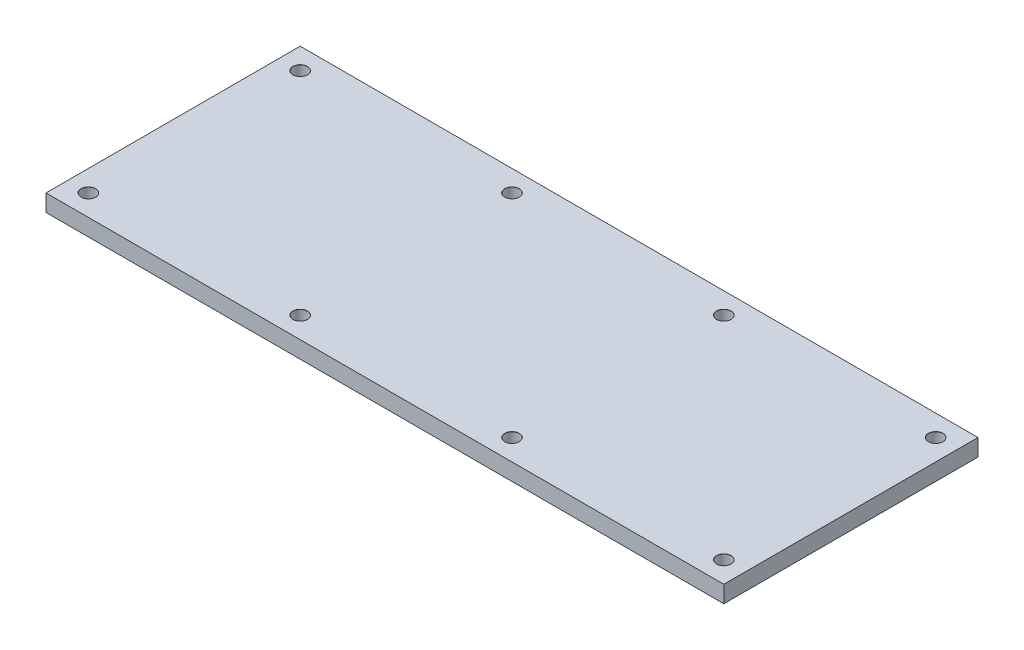
ISO-10303-21;
HEADER;
FILE_DESCRIPTION(('STEP AP214'),'2;1');
FILE_NAME('part.step','',(''),(''),'','','');
FILE_SCHEMA(('AUTOMOTIVE_DESIGN { 1 0 10303 214 1 1 1 1 }'));
ENDSEC;
DATA;
#1=APPLICATION_CONTEXT('core data for automotive mechanical design processes');
#2=APPLICATION_PROTOCOL_DEFINITION('international standard','automotive_design',2000,#1);
#3=PRODUCT_CONTEXT('',#1,'mechanical');
#4=PRODUCT('Part','Part','',(#3));
#5=PRODUCT_RELATED_PRODUCT_CATEGORY('part','',(#4));
#6=PRODUCT_DEFINITION_FORMATION('','',#4);
#7=PRODUCT_DEFINITION_CONTEXT('part definition',#1,'design');
#8=PRODUCT_DEFINITION('design','',#6,#7);
#9=PRODUCT_DEFINITION_SHAPE('','',#8);
#10=(LENGTH_UNIT() NAMED_UNIT(*) SI_UNIT(.MILLI.,.METRE.));
#11=(NAMED_UNIT(*) PLANE_ANGLE_UNIT() SI_UNIT($,.RADIAN.));
#12=(NAMED_UNIT(*) SI_UNIT($,.STERADIAN.) SOLID_ANGLE_UNIT());
#13=UNCERTAINTY_MEASURE_WITH_UNIT(LENGTH_MEASURE(1.E-05),#10,'distance_accuracy_value','');
#14=(GEOMETRIC_REPRESENTATION_CONTEXT(3) GLOBAL_UNCERTAINTY_ASSIGNED_CONTEXT((#13)) GLOBAL_UNIT_ASSIGNED_CONTEXT((#10,
#11,#12)) REPRESENTATION_CONTEXT('',''));
#15=CARTESIAN_POINT('',(0.,0.,0.));
#16=DIRECTION('',(0.,0.,1.));
#17=DIRECTION('',(1.,0.,0.));
#18=AXIS2_PLACEMENT_3D('',#15,#16,#17);
#19=CARTESIAN_POINT('',(0.,4.,0.));
#20=DIRECTION('',(0.,-1.,0.));
#21=DIRECTION('',(0.,0.,-1.));
#22=AXIS2_PLACEMENT_3D('',#19,#20,#21);
#23=PLANE('',#22);
#24=CARTESIAN_POINT('',(4.99999999999984,4.,-55.));
#25=DIRECTION('',(0.,1.,0.));
#26=DIRECTION('',(0.,0.,1.));
#27=AXIS2_PLACEMENT_3D('',#24,#25,#26);
#28=CIRCLE('',#27,1.725);
#29=CARTESIAN_POINT('',(4.99999999999984,4.,-53.275));
#30=VERTEX_POINT('',#29);
#31=EDGE_CURVE('E178',#30,#30,#28,.T.);
#32=ORIENTED_EDGE('',*,*,#31,.F.);
#33=EDGE_LOOP('',(#32));
#34=FACE_BOUND('',#33,.T.);
#35=DIRECTION('',(0.,0.,1.));
#36=VECTOR('',#35,1.);
#37=CARTESIAN_POINT('',(0.,4.,0.));
#38=LINE('',#37,#36);
#39=CARTESIAN_POINT('',(0.,4.,-60.));
#40=VERTEX_POINT('',#39);
#41=CARTESIAN_POINT('',(0.,4.,0.));
#42=VERTEX_POINT('',#41);
#43=EDGE_CURVE('E98',#40,#42,#38,.T.);
#44=ORIENTED_EDGE('',*,*,#43,.T.);
#45=DIRECTION('',(1.,0.,0.));
#46=VECTOR('',#45,1.);
#47=CARTESIAN_POINT('',(0.,4.,0.));
#48=LINE('',#47,#46);
#49=CARTESIAN_POINT('',(160.,4.,0.));
#50=VERTEX_POINT('',#49);
#51=EDGE_CURVE('E93',#42,#50,#48,.T.);
#52=ORIENTED_EDGE('',*,*,#51,.T.);
#53=DIRECTION('',(0.,0.,-1.));
#54=VECTOR('',#53,1.);
#55=CARTESIAN_POINT('',(160.,4.,0.));
#56=LINE('',#55,#54);
#57=CARTESIAN_POINT('',(160.,4.,-60.));
#58=VERTEX_POINT('',#57);
#59=EDGE_CURVE('E96',#50,#58,#56,.T.);
#60=ORIENTED_EDGE('',*,*,#59,.T.);
#61=DIRECTION('',(-1.,0.,0.));
#62=VECTOR('',#61,1.);
#63=CARTESIAN_POINT('',(0.,4.,-60.));
#64=LINE('',#63,#62);
#65=EDGE_CURVE('E63',#58,#40,#64,.T.);
#66=ORIENTED_EDGE('',*,*,#65,.T.);
#67=EDGE_LOOP('',(#44,#52,#60,#66));
#68=FACE_BOUND('',#67,.T.);
#69=CARTESIAN_POINT('',(155.,4.,-55.));
#70=DIRECTION('',(0.,1.,0.));
#71=DIRECTION('',(0.,0.,1.));
#72=AXIS2_PLACEMENT_3D('',#69,#70,#71);
#73=CIRCLE('',#72,1.725);
#74=CARTESIAN_POINT('',(155.,4.,-53.275));
#75=VERTEX_POINT('',#74);
#76=EDGE_CURVE('E142',#75,#75,#73,.T.);
#77=ORIENTED_EDGE('',*,*,#76,.F.);
#78=EDGE_LOOP('',(#77));
#79=FACE_BOUND('',#78,.T.);
#80=CARTESIAN_POINT('',(105.,4.,-55.));
#81=DIRECTION('',(0.,1.,0.));
#82=DIRECTION('',(0.,0.,1.));
#83=AXIS2_PLACEMENT_3D('',#80,#81,#82);
#84=CIRCLE('',#83,1.725);
#85=CARTESIAN_POINT('',(105.,4.,-53.275));
#86=VERTEX_POINT('',#85);
#87=EDGE_CURVE('E154',#86,#86,#84,.T.);
#88=ORIENTED_EDGE('',*,*,#87,.F.);
#89=EDGE_LOOP('',(#88));
#90=FACE_BOUND('',#89,.T.);
#91=CARTESIAN_POINT('',(54.9999999999998,4.,-55.));
#92=DIRECTION('',(0.,1.,0.));
#93=DIRECTION('',(0.,0.,1.));
#94=AXIS2_PLACEMENT_3D('',#91,#92,#93);
#95=CIRCLE('',#94,1.725);
#96=CARTESIAN_POINT('',(54.9999999999998,4.,-53.275));
#97=VERTEX_POINT('',#96);
#98=EDGE_CURVE('E166',#97,#97,#95,.T.);
#99=ORIENTED_EDGE('',*,*,#98,.F.);
#100=EDGE_LOOP('',(#99));
#101=FACE_BOUND('',#100,.T.);
#102=CARTESIAN_POINT('',(155.,4.,-5.));
#103=DIRECTION('',(0.,1.,0.));
#104=DIRECTION('',(0.,0.,1.));
#105=AXIS2_PLACEMENT_3D('',#102,#103,#104);
#106=CIRCLE('',#105,1.725);
#107=CARTESIAN_POINT('',(155.,4.,-3.27499999999999));
#108=VERTEX_POINT('',#107);
#109=EDGE_CURVE('E190',#108,#108,#106,.T.);
#110=ORIENTED_EDGE('',*,*,#109,.F.);
#111=EDGE_LOOP('',(#110));
#112=FACE_BOUND('',#111,.T.);
#113=CARTESIAN_POINT('',(105.,4.,-5.));
#114=DIRECTION('',(0.,1.,0.));
#115=DIRECTION('',(0.,0.,1.));
#116=AXIS2_PLACEMENT_3D('',#113,#114,#115);
#117=CIRCLE('',#116,1.725);
#118=CARTESIAN_POINT('',(105.,4.,-3.27499999999999));
#119=VERTEX_POINT('',#118);
#120=EDGE_CURVE('E202',#119,#119,#117,.T.);
#121=ORIENTED_EDGE('',*,*,#120,.F.);
#122=EDGE_LOOP('',(#121));
#123=FACE_BOUND('',#122,.T.);
#124=CARTESIAN_POINT('',(55.,4.,-5.));
#125=DIRECTION('',(0.,1.,0.));
#126=DIRECTION('',(0.,0.,1.));
#127=AXIS2_PLACEMENT_3D('',#124,#125,#126);
#128=CIRCLE('',#127,1.725);
#129=CARTESIAN_POINT('',(55.,4.,-3.275));
#130=VERTEX_POINT('',#129);
#131=EDGE_CURVE('E214',#130,#130,#128,.T.);
#132=ORIENTED_EDGE('',*,*,#131,.F.);
#133=EDGE_LOOP('',(#132));
#134=FACE_BOUND('',#133,.T.);
#135=CARTESIAN_POINT('',(5.00000000000001,4.,-5.));
#136=DIRECTION('',(0.,1.,0.));
#137=DIRECTION('',(0.,0.,1.));
#138=AXIS2_PLACEMENT_3D('',#135,#136,#137);
#139=CIRCLE('',#138,1.725);
#140=CARTESIAN_POINT('',(5.00000000000001,4.,-3.275));
#141=VERTEX_POINT('',#140);
#142=EDGE_CURVE('E226',#141,#141,#139,.T.);
#143=ORIENTED_EDGE('',*,*,#142,.F.);
#144=EDGE_LOOP('',(#143));
#145=FACE_BOUND('',#144,.T.);
#146=ADVANCED_FACE('F45',(#34,#68,#79,#90,#101,#112,#123,#134,#145),#23,.F.);
#147=CARTESIAN_POINT('',(0.,4.,0.));
#148=DIRECTION('',(1.,0.,0.));
#149=DIRECTION('',(0.,0.,-1.));
#150=AXIS2_PLACEMENT_3D('',#147,#148,#149);
#151=PLANE('',#150);
#152=DIRECTION('',(0.,0.,1.));
#153=VECTOR('',#152,1.);
#154=CARTESIAN_POINT('',(0.,0.,0.));
#155=LINE('',#154,#153);
#156=CARTESIAN_POINT('',(0.,0.,-60.));
#157=VERTEX_POINT('',#156);
#158=CARTESIAN_POINT('',(0.,0.,0.));
#159=VERTEX_POINT('',#158);
#160=EDGE_CURVE('E114',#157,#159,#155,.T.);
#161=ORIENTED_EDGE('',*,*,#160,.T.);
#162=DIRECTION('',(0.,-1.,0.));
#163=VECTOR('',#162,1.);
#164=CARTESIAN_POINT('',(0.,4.,0.));
#165=LINE('',#164,#163);
#166=EDGE_CURVE('E11',#42,#159,#165,.T.);
#167=ORIENTED_EDGE('',*,*,#166,.F.);
#168=ORIENTED_EDGE('',*,*,#43,.F.);
#169=DIRECTION('',(0.,-1.,0.));
#170=VECTOR('',#169,1.);
#171=CARTESIAN_POINT('',(0.,4.,-60.));
#172=LINE('',#171,#170);
#173=EDGE_CURVE('E110',#40,#157,#172,.T.);
#174=ORIENTED_EDGE('',*,*,#173,.T.);
#175=EDGE_LOOP('',(#161,#167,#168,#174));
#176=FACE_BOUND('',#175,.T.);
#177=ADVANCED_FACE('F47',(#176),#151,.F.);
#178=CARTESIAN_POINT('',(0.,4.,0.));
#179=DIRECTION('',(0.,0.,-1.));
#180=DIRECTION('',(-1.,0.,0.));
#181=AXIS2_PLACEMENT_3D('',#178,#179,#180);
#182=PLANE('',#181);
#183=DIRECTION('',(1.,0.,0.));
#184=VECTOR('',#183,1.);
#185=CARTESIAN_POINT('',(0.,0.,0.));
#186=LINE('',#185,#184);
#187=CARTESIAN_POINT('',(160.,0.,0.));
#188=VERTEX_POINT('',#187);
#189=EDGE_CURVE('E103',#159,#188,#186,.T.);
#190=ORIENTED_EDGE('',*,*,#189,.T.);
#191=DIRECTION('',(0.,-1.,0.));
#192=VECTOR('',#191,1.);
#193=CARTESIAN_POINT('',(160.,4.,0.));
#194=LINE('',#193,#192);
#195=EDGE_CURVE('E55',#50,#188,#194,.T.);
#196=ORIENTED_EDGE('',*,*,#195,.F.);
#197=ORIENTED_EDGE('',*,*,#51,.F.);
#198=ORIENTED_EDGE('',*,*,#166,.T.);
#199=EDGE_LOOP('',(#190,#196,#197,#198));
#200=FACE_BOUND('',#199,.T.);
#201=ADVANCED_FACE('F102',(#200),#182,.F.);
#202=CARTESIAN_POINT('',(160.,4.,0.));
#203=DIRECTION('',(-1.,0.,0.));
#204=DIRECTION('',(0.,0.,1.));
#205=AXIS2_PLACEMENT_3D('',#202,#203,#204);
#206=PLANE('',#205);
#207=DIRECTION('',(0.,0.,-1.));
#208=VECTOR('',#207,1.);
#209=CARTESIAN_POINT('',(160.,0.,0.));
#210=LINE('',#209,#208);
#211=CARTESIAN_POINT('',(160.,0.,-60.));
#212=VERTEX_POINT('',#211);
#213=EDGE_CURVE('E80',#188,#212,#210,.T.);
#214=ORIENTED_EDGE('',*,*,#213,.T.);
#215=DIRECTION('',(0.,-1.,0.));
#216=VECTOR('',#215,1.);
#217=CARTESIAN_POINT('',(160.,4.,-60.));
#218=LINE('',#217,#216);
#219=EDGE_CURVE('E105',#58,#212,#218,.T.);
#220=ORIENTED_EDGE('',*,*,#219,.F.);
#221=ORIENTED_EDGE('',*,*,#59,.F.);
#222=ORIENTED_EDGE('',*,*,#195,.T.);
#223=EDGE_LOOP('',(#214,#220,#221,#222));
#224=FACE_BOUND('',#223,.T.);
#225=ADVANCED_FACE('F106',(#224),#206,.F.);
#226=CARTESIAN_POINT('',(0.,4.,-60.));
#227=DIRECTION('',(0.,0.,1.));
#228=DIRECTION('',(1.,0.,0.));
#229=AXIS2_PLACEMENT_3D('',#226,#227,#228);
#230=PLANE('',#229);
#231=DIRECTION('',(-1.,0.,0.));
#232=VECTOR('',#231,1.);
#233=CARTESIAN_POINT('',(0.,0.,-60.));
#234=LINE('',#233,#232);
#235=EDGE_CURVE('E86',#212,#157,#234,.T.);
#236=ORIENTED_EDGE('',*,*,#235,.T.);
#237=ORIENTED_EDGE('',*,*,#173,.F.);
#238=ORIENTED_EDGE('',*,*,#65,.F.);
#239=ORIENTED_EDGE('',*,*,#219,.T.);
#240=EDGE_LOOP('',(#236,#237,#238,#239));
#241=FACE_BOUND('',#240,.T.);
#242=ADVANCED_FACE('F128',(#241),#230,.F.);
#243=CARTESIAN_POINT('',(0.,0.,0.));
#244=DIRECTION('',(0.,-1.,0.));
#245=DIRECTION('',(0.,0.,-1.));
#246=AXIS2_PLACEMENT_3D('',#243,#244,#245);
#247=PLANE('',#246);
#248=CARTESIAN_POINT('',(5.00000000000001,0.,-5.));
#249=DIRECTION('',(0.,-1.,0.));
#250=DIRECTION('',(0.,0.,-1.));
#251=AXIS2_PLACEMENT_3D('',#248,#249,#250);
#252=CIRCLE('',#251,1.7);
#253=CARTESIAN_POINT('',(5.00000000000001,0.,-6.7));
#254=VERTEX_POINT('',#253);
#255=EDGE_CURVE('E218',#254,#254,#252,.T.);
#256=ORIENTED_EDGE('',*,*,#255,.F.);
#257=EDGE_LOOP('',(#256));
#258=FACE_BOUND('',#257,.T.);
#259=CARTESIAN_POINT('',(55.,0.,-5.));
#260=DIRECTION('',(0.,-1.,0.));
#261=DIRECTION('',(0.,0.,-1.));
#262=AXIS2_PLACEMENT_3D('',#259,#260,#261);
#263=CIRCLE('',#262,1.7);
#264=CARTESIAN_POINT('',(55.,0.,-6.7));
#265=VERTEX_POINT('',#264);
#266=EDGE_CURVE('E206',#265,#265,#263,.T.);
#267=ORIENTED_EDGE('',*,*,#266,.F.);
#268=EDGE_LOOP('',(#267));
#269=FACE_BOUND('',#268,.T.);
#270=CARTESIAN_POINT('',(105.,0.,-5.));
#271=DIRECTION('',(0.,-1.,0.));
#272=DIRECTION('',(0.,0.,-1.));
#273=AXIS2_PLACEMENT_3D('',#270,#271,#272);
#274=CIRCLE('',#273,1.69999999999999);
#275=CARTESIAN_POINT('',(105.,0.,-6.69999999999999));
#276=VERTEX_POINT('',#275);
#277=EDGE_CURVE('E194',#276,#276,#274,.T.);
#278=ORIENTED_EDGE('',*,*,#277,.F.);
#279=EDGE_LOOP('',(#278));
#280=FACE_BOUND('',#279,.T.);
#281=CARTESIAN_POINT('',(155.,0.,-5.));
#282=DIRECTION('',(0.,-1.,0.));
#283=DIRECTION('',(0.,0.,-1.));
#284=AXIS2_PLACEMENT_3D('',#281,#282,#283);
#285=CIRCLE('',#284,1.70000000000001);
#286=CARTESIAN_POINT('',(155.,0.,-6.7));
#287=VERTEX_POINT('',#286);
#288=EDGE_CURVE('E182',#287,#287,#285,.T.);
#289=ORIENTED_EDGE('',*,*,#288,.F.);
#290=EDGE_LOOP('',(#289));
#291=FACE_BOUND('',#290,.T.);
#292=CARTESIAN_POINT('',(4.99999999999984,0.,-55.));
#293=DIRECTION('',(0.,-1.,0.));
#294=DIRECTION('',(0.,0.,-1.));
#295=AXIS2_PLACEMENT_3D('',#292,#293,#294);
#296=CIRCLE('',#295,1.7);
#297=CARTESIAN_POINT('',(4.99999999999984,0.,-56.7));
#298=VERTEX_POINT('',#297);
#299=EDGE_CURVE('E170',#298,#298,#296,.T.);
#300=ORIENTED_EDGE('',*,*,#299,.F.);
#301=EDGE_LOOP('',(#300));
#302=FACE_BOUND('',#301,.T.);
#303=CARTESIAN_POINT('',(54.9999999999998,0.,-55.));
#304=DIRECTION('',(0.,-1.,0.));
#305=DIRECTION('',(0.,0.,-1.));
#306=AXIS2_PLACEMENT_3D('',#303,#304,#305);
#307=CIRCLE('',#306,1.7);
#308=CARTESIAN_POINT('',(54.9999999999998,0.,-56.7));
#309=VERTEX_POINT('',#308);
#310=EDGE_CURVE('E158',#309,#309,#307,.T.);
#311=ORIENTED_EDGE('',*,*,#310,.F.);
#312=EDGE_LOOP('',(#311));
#313=FACE_BOUND('',#312,.T.);
#314=CARTESIAN_POINT('',(105.,0.,-55.));
#315=DIRECTION('',(0.,-1.,0.));
#316=DIRECTION('',(0.,0.,-1.));
#317=AXIS2_PLACEMENT_3D('',#314,#315,#316);
#318=CIRCLE('',#317,1.69999999999999);
#319=CARTESIAN_POINT('',(105.,0.,-56.7));
#320=VERTEX_POINT('',#319);
#321=EDGE_CURVE('E146',#320,#320,#318,.T.);
#322=ORIENTED_EDGE('',*,*,#321,.F.);
#323=EDGE_LOOP('',(#322));
#324=FACE_BOUND('',#323,.T.);
#325=CARTESIAN_POINT('',(155.,0.,-55.));
#326=DIRECTION('',(0.,-1.,0.));
#327=DIRECTION('',(0.,0.,-1.));
#328=AXIS2_PLACEMENT_3D('',#325,#326,#327);
#329=CIRCLE('',#328,1.70000000000001);
#330=CARTESIAN_POINT('',(155.,0.,-56.7));
#331=VERTEX_POINT('',#330);
#332=EDGE_CURVE('E118',#331,#331,#329,.T.);
#333=ORIENTED_EDGE('',*,*,#332,.F.);
#334=EDGE_LOOP('',(#333));
#335=FACE_BOUND('',#334,.T.);
#336=ORIENTED_EDGE('',*,*,#160,.F.);
#337=ORIENTED_EDGE('',*,*,#235,.F.);
#338=ORIENTED_EDGE('',*,*,#213,.F.);
#339=ORIENTED_EDGE('',*,*,#189,.F.);
#340=EDGE_LOOP('',(#336,#337,#338,#339));
#341=FACE_BOUND('',#340,.T.);
#342=ADVANCED_FACE('F131',(#258,#269,#280,#291,#302,#313,#324,#335,#341),#247,.T.);
#343=CARTESIAN_POINT('',(155.,4.,-55.));
#344=DIRECTION('',(0.,1.,0.));
#345=DIRECTION('',(0.,0.,1.));
#346=AXIS2_PLACEMENT_3D('',#343,#344,#345);
#347=CYLINDRICAL_SURFACE('',#346,1.70000000000001);
#348=CARTESIAN_POINT('',(155.,3.975,-55.));
#349=DIRECTION('',(0.,1.,0.));
#350=DIRECTION('',(0.,0.,1.));
#351=AXIS2_PLACEMENT_3D('',#348,#349,#350);
#352=CIRCLE('',#351,1.70000000000001);
#353=CARTESIAN_POINT('',(155.,3.975,-53.3));
#354=VERTEX_POINT('',#353);
#355=EDGE_CURVE('E138',#354,#354,#352,.T.);
#356=ORIENTED_EDGE('',*,*,#355,.T.);
#357=EDGE_LOOP('',(#356));
#358=FACE_BOUND('',#357,.T.);
#359=ORIENTED_EDGE('',*,*,#332,.T.);
#360=EDGE_LOOP('',(#359));
#361=FACE_BOUND('',#360,.T.);
#362=ADVANCED_FACE('F244',(#358,#361),#347,.F.);
#363=CARTESIAN_POINT('',(155.,4.,-55.));
#364=DIRECTION('',(0.,1.,0.));
#365=DIRECTION('',(0.,0.,1.));
#366=AXIS2_PLACEMENT_3D('',#363,#364,#365);
#367=CONICAL_SURFACE('',#366,1.725,0.785398163397379);
#368=ORIENTED_EDGE('',*,*,#355,.F.);
#369=EDGE_LOOP('',(#368));
#370=FACE_BOUND('',#369,.T.);
#371=ORIENTED_EDGE('',*,*,#76,.T.);
#372=EDGE_LOOP('',(#371));
#373=FACE_BOUND('',#372,.T.);
#374=ADVANCED_FACE('F285',(#370,#373),#367,.F.);
#375=CARTESIAN_POINT('',(105.,4.,-55.));
#376=DIRECTION('',(0.,1.,0.));
#377=DIRECTION('',(0.,0.,1.));
#378=AXIS2_PLACEMENT_3D('',#375,#376,#377);
#379=CYLINDRICAL_SURFACE('',#378,1.69999999999999);
#380=CARTESIAN_POINT('',(105.,3.975,-55.));
#381=DIRECTION('',(0.,1.,0.));
#382=DIRECTION('',(0.,0.,1.));
#383=AXIS2_PLACEMENT_3D('',#380,#381,#382);
#384=CIRCLE('',#383,1.69999999999999);
#385=CARTESIAN_POINT('',(105.,3.975,-53.3));
#386=VERTEX_POINT('',#385);
#387=EDGE_CURVE('E150',#386,#386,#384,.T.);
#388=ORIENTED_EDGE('',*,*,#387,.T.);
#389=EDGE_LOOP('',(#388));
#390=FACE_BOUND('',#389,.T.);
#391=ORIENTED_EDGE('',*,*,#321,.T.);
#392=EDGE_LOOP('',(#391));
#393=FACE_BOUND('',#392,.T.);
#394=ADVANCED_FACE('F294',(#390,#393),#379,.F.);
#395=CARTESIAN_POINT('',(105.,4.,-55.));
#396=DIRECTION('',(0.,1.,0.));
#397=DIRECTION('',(0.,0.,1.));
#398=AXIS2_PLACEMENT_3D('',#395,#396,#397);
#399=CONICAL_SURFACE('',#398,1.725,0.785398163397656);
#400=ORIENTED_EDGE('',*,*,#387,.F.);
#401=EDGE_LOOP('',(#400));
#402=FACE_BOUND('',#401,.T.);
#403=ORIENTED_EDGE('',*,*,#87,.T.);
#404=EDGE_LOOP('',(#403));
#405=FACE_BOUND('',#404,.T.);
#406=ADVANCED_FACE('F303',(#402,#405),#399,.F.);
#407=CARTESIAN_POINT('',(54.9999999999998,4.,-55.));
#408=DIRECTION('',(0.,1.,0.));
#409=DIRECTION('',(0.,0.,1.));
#410=AXIS2_PLACEMENT_3D('',#407,#408,#409);
#411=CYLINDRICAL_SURFACE('',#410,1.7);
#412=CARTESIAN_POINT('',(54.9999999999998,3.975,-55.));
#413=DIRECTION('',(0.,1.,0.));
#414=DIRECTION('',(0.,0.,1.));
#415=AXIS2_PLACEMENT_3D('',#412,#413,#414);
#416=CIRCLE('',#415,1.7);
#417=CARTESIAN_POINT('',(54.9999999999998,3.975,-53.3));
#418=VERTEX_POINT('',#417);
#419=EDGE_CURVE('E162',#418,#418,#416,.T.);
#420=ORIENTED_EDGE('',*,*,#419,.T.);
#421=EDGE_LOOP('',(#420));
#422=FACE_BOUND('',#421,.T.);
#423=ORIENTED_EDGE('',*,*,#310,.T.);
#424=EDGE_LOOP('',(#423));
#425=FACE_BOUND('',#424,.T.);
#426=ADVANCED_FACE('F313',(#422,#425),#411,.F.);
#427=CARTESIAN_POINT('',(54.9999999999998,4.,-55.));
#428=DIRECTION('',(0.,1.,0.));
#429=DIRECTION('',(0.,0.,1.));
#430=AXIS2_PLACEMENT_3D('',#427,#428,#429);
#431=CONICAL_SURFACE('',#430,1.725,0.785398163397379);
#432=ORIENTED_EDGE('',*,*,#419,.F.);
#433=EDGE_LOOP('',(#432));
#434=FACE_BOUND('',#433,.T.);
#435=ORIENTED_EDGE('',*,*,#98,.T.);
#436=EDGE_LOOP('',(#435));
#437=FACE_BOUND('',#436,.T.);
#438=ADVANCED_FACE('F323',(#434,#437),#431,.F.);
#439=CARTESIAN_POINT('',(4.99999999999984,4.,-55.));
#440=DIRECTION('',(0.,1.,0.));
#441=DIRECTION('',(0.,0.,1.));
#442=AXIS2_PLACEMENT_3D('',#439,#440,#441);
#443=CYLINDRICAL_SURFACE('',#442,1.7);
#444=CARTESIAN_POINT('',(4.99999999999984,3.975,-55.));
#445=DIRECTION('',(0.,1.,0.));
#446=DIRECTION('',(0.,0.,1.));
#447=AXIS2_PLACEMENT_3D('',#444,#445,#446);
#448=CIRCLE('',#447,1.7);
#449=CARTESIAN_POINT('',(4.99999999999984,3.975,-53.3));
#450=VERTEX_POINT('',#449);
#451=EDGE_CURVE('E174',#450,#450,#448,.T.);
#452=ORIENTED_EDGE('',*,*,#451,.T.);
#453=EDGE_LOOP('',(#452));
#454=FACE_BOUND('',#453,.T.);
#455=ORIENTED_EDGE('',*,*,#299,.T.);
#456=EDGE_LOOP('',(#455));
#457=FACE_BOUND('',#456,.T.);
#458=ADVANCED_FACE('F333',(#454,#457),#443,.F.);
#459=CARTESIAN_POINT('',(4.99999999999984,4.,-55.));
#460=DIRECTION('',(0.,1.,0.));
#461=DIRECTION('',(0.,0.,1.));
#462=AXIS2_PLACEMENT_3D('',#459,#460,#461);
#463=CONICAL_SURFACE('',#462,1.725,0.785398163397448);
#464=ORIENTED_EDGE('',*,*,#451,.F.);
#465=EDGE_LOOP('',(#464));
#466=FACE_BOUND('',#465,.T.);
#467=ORIENTED_EDGE('',*,*,#31,.T.);
#468=EDGE_LOOP('',(#467));
#469=FACE_BOUND('',#468,.T.);
#470=ADVANCED_FACE('F343',(#466,#469),#463,.F.);
#471=CARTESIAN_POINT('',(155.,4.,-5.));
#472=DIRECTION('',(0.,1.,0.));
#473=DIRECTION('',(0.,0.,1.));
#474=AXIS2_PLACEMENT_3D('',#471,#472,#473);
#475=CYLINDRICAL_SURFACE('',#474,1.70000000000001);
#476=CARTESIAN_POINT('',(155.,3.975,-5.));
#477=DIRECTION('',(0.,1.,0.));
#478=DIRECTION('',(0.,0.,1.));
#479=AXIS2_PLACEMENT_3D('',#476,#477,#478);
#480=CIRCLE('',#479,1.70000000000001);
#481=CARTESIAN_POINT('',(155.,3.975,-3.29999999999999));
#482=VERTEX_POINT('',#481);
#483=EDGE_CURVE('E186',#482,#482,#480,.T.);
#484=ORIENTED_EDGE('',*,*,#483,.T.);
#485=EDGE_LOOP('',(#484));
#486=FACE_BOUND('',#485,.T.);
#487=ORIENTED_EDGE('',*,*,#288,.T.);
#488=EDGE_LOOP('',(#487));
#489=FACE_BOUND('',#488,.T.);
#490=ADVANCED_FACE('F353',(#486,#489),#475,.F.);
#491=CARTESIAN_POINT('',(155.,4.,-5.));
#492=DIRECTION('',(0.,1.,0.));
#493=DIRECTION('',(0.,0.,1.));
#494=AXIS2_PLACEMENT_3D('',#491,#492,#493);
#495=CONICAL_SURFACE('',#494,1.725,0.785398163397379);
#496=ORIENTED_EDGE('',*,*,#483,.F.);
#497=EDGE_LOOP('',(#496));
#498=FACE_BOUND('',#497,.T.);
#499=ORIENTED_EDGE('',*,*,#109,.T.);
#500=EDGE_LOOP('',(#499));
#501=FACE_BOUND('',#500,.T.);
#502=ADVANCED_FACE('F363',(#498,#501),#495,.F.);
#503=CARTESIAN_POINT('',(105.,4.,-5.));
#504=DIRECTION('',(0.,1.,0.));
#505=DIRECTION('',(0.,0.,1.));
#506=AXIS2_PLACEMENT_3D('',#503,#504,#505);
#507=CYLINDRICAL_SURFACE('',#506,1.69999999999999);
#508=CARTESIAN_POINT('',(105.,3.975,-5.));
#509=DIRECTION('',(0.,1.,0.));
#510=DIRECTION('',(0.,0.,1.));
#511=AXIS2_PLACEMENT_3D('',#508,#509,#510);
#512=CIRCLE('',#511,1.69999999999999);
#513=CARTESIAN_POINT('',(105.,3.975,-3.3));
#514=VERTEX_POINT('',#513);
#515=EDGE_CURVE('E198',#514,#514,#512,.T.);
#516=ORIENTED_EDGE('',*,*,#515,.T.);
#517=EDGE_LOOP('',(#516));
#518=FACE_BOUND('',#517,.T.);
#519=ORIENTED_EDGE('',*,*,#277,.T.);
#520=EDGE_LOOP('',(#519));
#521=FACE_BOUND('',#520,.T.);
#522=ADVANCED_FACE('F373',(#518,#521),#507,.F.);
#523=CARTESIAN_POINT('',(105.,4.,-5.));
#524=DIRECTION('',(0.,1.,0.));
#525=DIRECTION('',(0.,0.,1.));
#526=AXIS2_PLACEMENT_3D('',#523,#524,#525);
#527=CONICAL_SURFACE('',#526,1.725,0.785398163397656);
#528=ORIENTED_EDGE('',*,*,#515,.F.);
#529=EDGE_LOOP('',(#528));
#530=FACE_BOUND('',#529,.T.);
#531=ORIENTED_EDGE('',*,*,#120,.T.);
#532=EDGE_LOOP('',(#531));
#533=FACE_BOUND('',#532,.T.);
#534=ADVANCED_FACE('F383',(#530,#533),#527,.F.);
#535=CARTESIAN_POINT('',(55.,4.,-5.));
#536=DIRECTION('',(0.,1.,0.));
#537=DIRECTION('',(0.,0.,1.));
#538=AXIS2_PLACEMENT_3D('',#535,#536,#537);
#539=CYLINDRICAL_SURFACE('',#538,1.7);
#540=CARTESIAN_POINT('',(55.,3.975,-5.));
#541=DIRECTION('',(0.,1.,0.));
#542=DIRECTION('',(0.,0.,1.));
#543=AXIS2_PLACEMENT_3D('',#540,#541,#542);
#544=CIRCLE('',#543,1.7);
#545=CARTESIAN_POINT('',(55.,3.975,-3.3));
#546=VERTEX_POINT('',#545);
#547=EDGE_CURVE('E210',#546,#546,#544,.T.);
#548=ORIENTED_EDGE('',*,*,#547,.T.);
#549=EDGE_LOOP('',(#548));
#550=FACE_BOUND('',#549,.T.);
#551=ORIENTED_EDGE('',*,*,#266,.T.);
#552=EDGE_LOOP('',(#551));
#553=FACE_BOUND('',#552,.T.);
#554=ADVANCED_FACE('F393',(#550,#553),#539,.F.);
#555=CARTESIAN_POINT('',(55.,4.,-5.));
#556=DIRECTION('',(0.,1.,0.));
#557=DIRECTION('',(0.,0.,1.));
#558=AXIS2_PLACEMENT_3D('',#555,#556,#557);
#559=CONICAL_SURFACE('',#558,1.725,0.785398163397379);
#560=ORIENTED_EDGE('',*,*,#547,.F.);
#561=EDGE_LOOP('',(#560));
#562=FACE_BOUND('',#561,.T.);
#563=ORIENTED_EDGE('',*,*,#131,.T.);
#564=EDGE_LOOP('',(#563));
#565=FACE_BOUND('',#564,.T.);
#566=ADVANCED_FACE('F403',(#562,#565),#559,.F.);
#567=CARTESIAN_POINT('',(5.00000000000001,4.,-5.));
#568=DIRECTION('',(0.,1.,0.));
#569=DIRECTION('',(0.,0.,1.));
#570=AXIS2_PLACEMENT_3D('',#567,#568,#569);
#571=CYLINDRICAL_SURFACE('',#570,1.7);
#572=CARTESIAN_POINT('',(5.00000000000001,3.975,-5.));
#573=DIRECTION('',(0.,1.,0.));
#574=DIRECTION('',(0.,0.,1.));
#575=AXIS2_PLACEMENT_3D('',#572,#573,#574);
#576=CIRCLE('',#575,1.7);
#577=CARTESIAN_POINT('',(5.00000000000001,3.975,-3.3));
#578=VERTEX_POINT('',#577);
#579=EDGE_CURVE('E222',#578,#578,#576,.T.);
#580=ORIENTED_EDGE('',*,*,#579,.T.);
#581=EDGE_LOOP('',(#580));
#582=FACE_BOUND('',#581,.T.);
#583=ORIENTED_EDGE('',*,*,#255,.T.);
#584=EDGE_LOOP('',(#583));
#585=FACE_BOUND('',#584,.T.);
#586=ADVANCED_FACE('F413',(#582,#585),#571,.F.);
#587=CARTESIAN_POINT('',(5.00000000000001,4.,-5.));
#588=DIRECTION('',(0.,1.,0.));
#589=DIRECTION('',(0.,0.,1.));
#590=AXIS2_PLACEMENT_3D('',#587,#588,#589);
#591=CONICAL_SURFACE('',#590,1.725,0.785398163397448);
#592=ORIENTED_EDGE('',*,*,#579,.F.);
#593=EDGE_LOOP('',(#592));
#594=FACE_BOUND('',#593,.T.);
#595=ORIENTED_EDGE('',*,*,#142,.T.);
#596=EDGE_LOOP('',(#595));
#597=FACE_BOUND('',#596,.T.);
#598=ADVANCED_FACE('F231',(#594,#597),#591,.F.);
#599=CLOSED_SHELL('',(#146,#177,#201,#225,#242,#342,#362,#374,#394,#406,#426,#438,#458,#470,
#490,#502,#522,#534,#554,#566,#586,#598));
#600=MANIFOLD_SOLID_BREP('B2',#599);
#601=ADVANCED_BREP_SHAPE_REPRESENTATION('',(#18,#600),#14);
#602=SHAPE_DEFINITION_REPRESENTATION(#9,#601);
ENDSEC;
END-ISO-10303-21;
